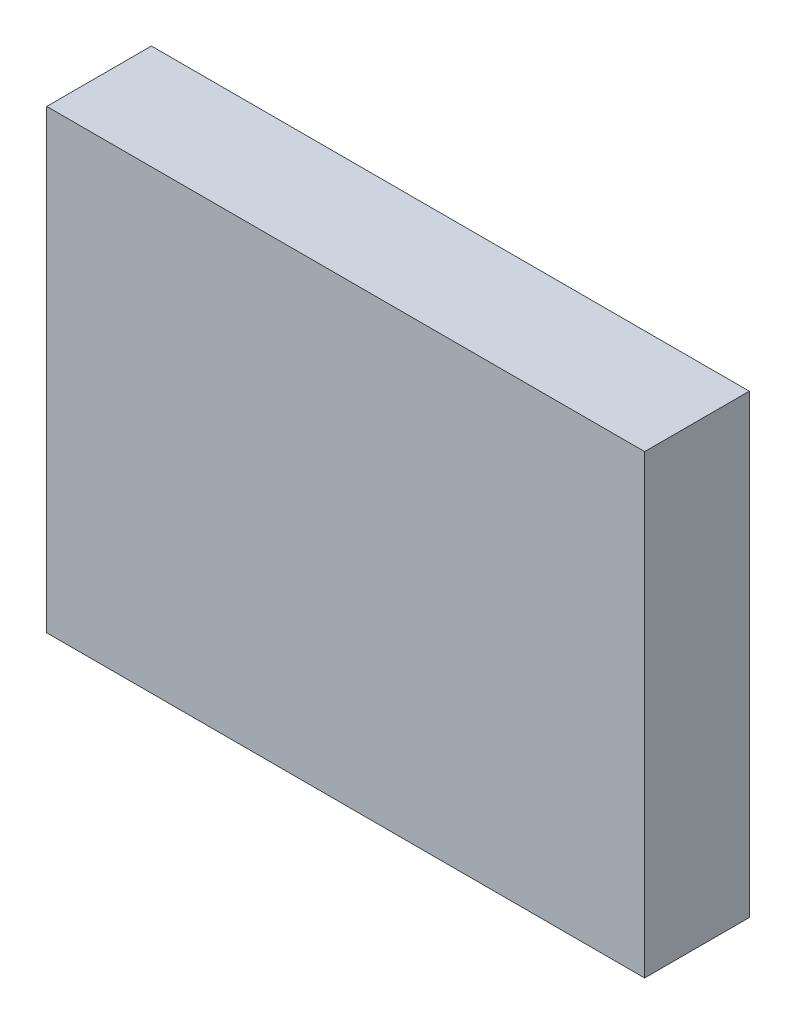
ISO-10303-21;
HEADER;
FILE_DESCRIPTION(('STEP AP214'),'2;1');
FILE_NAME('part.step','',(''),(''),'','','');
FILE_SCHEMA(('AUTOMOTIVE_DESIGN { 1 0 10303 214 1 1 1 1 }'));
ENDSEC;
DATA;
#1=APPLICATION_CONTEXT('core data for automotive mechanical design processes');
#2=APPLICATION_PROTOCOL_DEFINITION('international standard','automotive_design',2000,#1);
#3=PRODUCT_CONTEXT('',#1,'mechanical');
#4=PRODUCT('Part','Part','',(#3));
#5=PRODUCT_RELATED_PRODUCT_CATEGORY('part','',(#4));
#6=PRODUCT_DEFINITION_FORMATION('','',#4);
#7=PRODUCT_DEFINITION_CONTEXT('part definition',#1,'design');
#8=PRODUCT_DEFINITION('design','',#6,#7);
#9=PRODUCT_DEFINITION_SHAPE('','',#8);
#10=(LENGTH_UNIT() NAMED_UNIT(*) SI_UNIT(.MILLI.,.METRE.));
#11=(NAMED_UNIT(*) PLANE_ANGLE_UNIT() SI_UNIT($,.RADIAN.));
#12=(NAMED_UNIT(*) SI_UNIT($,.STERADIAN.) SOLID_ANGLE_UNIT());
#13=UNCERTAINTY_MEASURE_WITH_UNIT(LENGTH_MEASURE(1.E-05),#10,'distance_accuracy_value','');
#14=(GEOMETRIC_REPRESENTATION_CONTEXT(3) GLOBAL_UNCERTAINTY_ASSIGNED_CONTEXT((#13)) GLOBAL_UNIT_ASSIGNED_CONTEXT((#10,
#11,#12)) REPRESENTATION_CONTEXT('',''));
#15=CARTESIAN_POINT('',(0.,0.,0.));
#16=DIRECTION('',(0.,0.,1.));
#17=DIRECTION('',(1.,0.,0.));
#18=AXIS2_PLACEMENT_3D('',#15,#16,#17);
#19=CARTESIAN_POINT('',(-3.9808478020997,6.1,-2.8));
#20=DIRECTION('',(-1.,0.,0.));
#21=DIRECTION('',(0.,0.,1.));
#22=AXIS2_PLACEMENT_3D('',#19,#20,#21);
#23=PLANE('',#22);
#24=DIRECTION('',(0.,-1.,0.));
#25=VECTOR('',#24,1.);
#26=CARTESIAN_POINT('',(-3.9808478020997,6.1,0.));
#27=LINE('',#26,#25);
#28=CARTESIAN_POINT('',(-3.9808478020997,6.1,0.));
#29=VERTEX_POINT('',#28);
#30=CARTESIAN_POINT('',(-3.9808478020997,-6.1,0.));
#31=VERTEX_POINT('',#30);
#32=EDGE_CURVE('E79',#29,#31,#27,.T.);
#33=ORIENTED_EDGE('',*,*,#32,.T.);
#34=DIRECTION('',(0.,0.,1.));
#35=VECTOR('',#34,1.);
#36=CARTESIAN_POINT('',(-3.9808478020997,-6.1,-2.8));
#37=LINE('',#36,#35);
#38=CARTESIAN_POINT('',(-3.9808478020997,-6.1,-2.8));
#39=VERTEX_POINT('',#38);
#40=EDGE_CURVE('E11',#39,#31,#37,.T.);
#41=ORIENTED_EDGE('',*,*,#40,.F.);
#42=DIRECTION('',(0.,-1.,0.));
#43=VECTOR('',#42,1.);
#44=CARTESIAN_POINT('',(-3.9808478020997,6.1,-2.8));
#45=LINE('',#44,#43);
#46=CARTESIAN_POINT('',(-3.9808478020997,6.1,-2.8));
#47=VERTEX_POINT('',#46);
#48=EDGE_CURVE('E67',#47,#39,#45,.T.);
#49=ORIENTED_EDGE('',*,*,#48,.F.);
#50=DIRECTION('',(0.,0.,1.));
#51=VECTOR('',#50,1.);
#52=CARTESIAN_POINT('',(-3.9808478020997,6.1,-2.8));
#53=LINE('',#52,#51);
#54=EDGE_CURVE('E75',#47,#29,#53,.T.);
#55=ORIENTED_EDGE('',*,*,#54,.T.);
#56=EDGE_LOOP('',(#33,#41,#49,#55));
#57=FACE_BOUND('',#56,.T.);
#58=ADVANCED_FACE('F16',(#57),#23,.F.);
#59=CARTESIAN_POINT('',(-3.9808478020997,-6.1,-2.8));
#60=DIRECTION('',(0.,1.,0.));
#61=DIRECTION('',(0.,0.,1.));
#62=AXIS2_PLACEMENT_3D('',#59,#60,#61);
#63=PLANE('',#62);
#64=DIRECTION('',(-1.,0.,0.));
#65=VECTOR('',#64,1.);
#66=CARTESIAN_POINT('',(-3.9808478020997,-6.1,0.));
#67=LINE('',#66,#65);
#68=CARTESIAN_POINT('',(-19.9808478020997,-6.1,0.));
#69=VERTEX_POINT('',#68);
#70=EDGE_CURVE('E71',#31,#69,#67,.T.);
#71=ORIENTED_EDGE('',*,*,#70,.T.);
#72=DIRECTION('',(0.,0.,1.));
#73=VECTOR('',#72,1.);
#74=CARTESIAN_POINT('',(-19.9808478020997,-6.1,-2.8));
#75=LINE('',#74,#73);
#76=CARTESIAN_POINT('',(-19.9808478020997,-6.1,-2.8));
#77=VERTEX_POINT('',#76);
#78=EDGE_CURVE('E24',#77,#69,#75,.T.);
#79=ORIENTED_EDGE('',*,*,#78,.F.);
#80=DIRECTION('',(-1.,0.,0.));
#81=VECTOR('',#80,1.);
#82=CARTESIAN_POINT('',(-3.9808478020997,-6.1,-2.8));
#83=LINE('',#82,#81);
#84=EDGE_CURVE('E62',#39,#77,#83,.T.);
#85=ORIENTED_EDGE('',*,*,#84,.F.);
#86=ORIENTED_EDGE('',*,*,#40,.T.);
#87=EDGE_LOOP('',(#71,#79,#85,#86));
#88=FACE_BOUND('',#87,.T.);
#89=ADVANCED_FACE('F70',(#88),#63,.F.);
#90=CARTESIAN_POINT('',(-19.9808478020997,6.1,-2.8));
#91=DIRECTION('',(1.,0.,0.));
#92=DIRECTION('',(0.,0.,-1.));
#93=AXIS2_PLACEMENT_3D('',#90,#91,#92);
#94=PLANE('',#93);
#95=DIRECTION('',(0.,1.,0.));
#96=VECTOR('',#95,1.);
#97=CARTESIAN_POINT('',(-19.9808478020997,6.1,0.));
#98=LINE('',#97,#96);
#99=CARTESIAN_POINT('',(-19.9808478020997,6.1,0.));
#100=VERTEX_POINT('',#99);
#101=EDGE_CURVE('E49',#69,#100,#98,.T.);
#102=ORIENTED_EDGE('',*,*,#101,.T.);
#103=DIRECTION('',(0.,0.,1.));
#104=VECTOR('',#103,1.);
#105=CARTESIAN_POINT('',(-19.9808478020997,6.1,-2.8));
#106=LINE('',#105,#104);
#107=CARTESIAN_POINT('',(-19.9808478020997,6.1,-2.8));
#108=VERTEX_POINT('',#107);
#109=EDGE_CURVE('E72',#108,#100,#106,.T.);
#110=ORIENTED_EDGE('',*,*,#109,.F.);
#111=DIRECTION('',(0.,1.,0.));
#112=VECTOR('',#111,1.);
#113=CARTESIAN_POINT('',(-19.9808478020997,6.1,-2.8));
#114=LINE('',#113,#112);
#115=EDGE_CURVE('E65',#77,#108,#114,.T.);
#116=ORIENTED_EDGE('',*,*,#115,.F.);
#117=ORIENTED_EDGE('',*,*,#78,.T.);
#118=EDGE_LOOP('',(#102,#110,#116,#117));
#119=FACE_BOUND('',#118,.T.);
#120=ADVANCED_FACE('F73',(#119),#94,.F.);
#121=CARTESIAN_POINT('',(-3.9808478020997,6.1,-2.8));
#122=DIRECTION('',(0.,-1.,0.));
#123=DIRECTION('',(0.,0.,-1.));
#124=AXIS2_PLACEMENT_3D('',#121,#122,#123);
#125=PLANE('',#124);
#126=DIRECTION('',(1.,0.,0.));
#127=VECTOR('',#126,1.);
#128=CARTESIAN_POINT('',(-3.9808478020997,6.1,0.));
#129=LINE('',#128,#127);
#130=EDGE_CURVE('E55',#100,#29,#129,.T.);
#131=ORIENTED_EDGE('',*,*,#130,.T.);
#132=ORIENTED_EDGE('',*,*,#54,.F.);
#133=DIRECTION('',(1.,0.,0.));
#134=VECTOR('',#133,1.);
#135=CARTESIAN_POINT('',(-3.9808478020997,6.1,-2.8));
#136=LINE('',#135,#134);
#137=EDGE_CURVE('E32',#108,#47,#136,.T.);
#138=ORIENTED_EDGE('',*,*,#137,.F.);
#139=ORIENTED_EDGE('',*,*,#109,.T.);
#140=EDGE_LOOP('',(#131,#132,#138,#139));
#141=FACE_BOUND('',#140,.T.);
#142=ADVANCED_FACE('F86',(#141),#125,.F.);
#143=CARTESIAN_POINT('',(0.,0.,-2.8));
#144=DIRECTION('',(0.,0.,-1.));
#145=DIRECTION('',(-1.,0.,0.));
#146=AXIS2_PLACEMENT_3D('',#143,#144,#145);
#147=PLANE('',#146);
#148=ORIENTED_EDGE('',*,*,#48,.T.);
#149=ORIENTED_EDGE('',*,*,#84,.T.);
#150=ORIENTED_EDGE('',*,*,#115,.T.);
#151=ORIENTED_EDGE('',*,*,#137,.T.);
#152=EDGE_LOOP('',(#148,#149,#150,#151));
#153=FACE_BOUND('',#152,.T.);
#154=ADVANCED_FACE('F63',(#153),#147,.T.);
#155=CARTESIAN_POINT('',(0.,0.,0.));
#156=DIRECTION('',(0.,0.,-1.));
#157=DIRECTION('',(-1.,0.,0.));
#158=AXIS2_PLACEMENT_3D('',#155,#156,#157);
#159=PLANE('',#158);
#160=ORIENTED_EDGE('',*,*,#32,.F.);
#161=ORIENTED_EDGE('',*,*,#130,.F.);
#162=ORIENTED_EDGE('',*,*,#101,.F.);
#163=ORIENTED_EDGE('',*,*,#70,.F.);
#164=EDGE_LOOP('',(#160,#161,#162,#163));
#165=FACE_BOUND('',#164,.T.);
#166=ADVANCED_FACE('F89',(#165),#159,.F.);
#167=CLOSED_SHELL('',(#58,#89,#120,#142,#154,#166));
#168=MANIFOLD_SOLID_BREP('B1',#167);
#169=ADVANCED_BREP_SHAPE_REPRESENTATION('',(#18,#168),#14);
#170=SHAPE_DEFINITION_REPRESENTATION(#9,#169);
ENDSEC;
END-ISO-10303-21;
